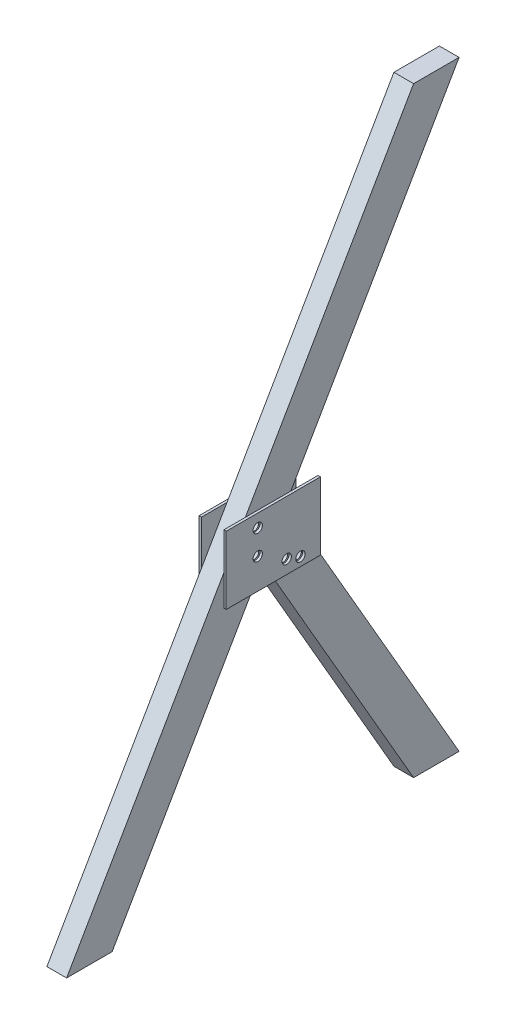
ISO-10303-21;
HEADER;
FILE_DESCRIPTION(('STEP AP214'),'2;1');
FILE_NAME('part.step','',(''),(''),'','','');
FILE_SCHEMA(('AUTOMOTIVE_DESIGN { 1 0 10303 214 1 1 1 1 }'));
ENDSEC;
DATA;
#1=APPLICATION_CONTEXT('core data for automotive mechanical design processes');
#2=APPLICATION_PROTOCOL_DEFINITION('international standard','automotive_design',2000,#1);
#3=PRODUCT_CONTEXT('',#1,'mechanical');
#4=PRODUCT('Part','Part','',(#3));
#5=PRODUCT_RELATED_PRODUCT_CATEGORY('part','',(#4));
#6=PRODUCT_DEFINITION_FORMATION('','',#4);
#7=PRODUCT_DEFINITION_CONTEXT('part definition',#1,'design');
#8=PRODUCT_DEFINITION('design','',#6,#7);
#9=PRODUCT_DEFINITION_SHAPE('','',#8);
#10=(LENGTH_UNIT() NAMED_UNIT(*) SI_UNIT(.MILLI.,.METRE.));
#11=(NAMED_UNIT(*) PLANE_ANGLE_UNIT() SI_UNIT($,.RADIAN.));
#12=(NAMED_UNIT(*) SI_UNIT($,.STERADIAN.) SOLID_ANGLE_UNIT());
#13=UNCERTAINTY_MEASURE_WITH_UNIT(LENGTH_MEASURE(1.E-05),#10,'distance_accuracy_value','');
#14=(GEOMETRIC_REPRESENTATION_CONTEXT(3) GLOBAL_UNCERTAINTY_ASSIGNED_CONTEXT((#13)) GLOBAL_UNIT_ASSIGNED_CONTEXT((#10,
#11,#12)) REPRESENTATION_CONTEXT('',''));
#15=CARTESIAN_POINT('',(0.,0.,0.));
#16=DIRECTION('',(0.,0.,1.));
#17=DIRECTION('',(1.,0.,0.));
#18=AXIS2_PLACEMENT_3D('',#15,#16,#17);
#19=CARTESIAN_POINT('',(-138.643481439755,307.813251285645,858.345365101981));
#20=DIRECTION('',(0.,1.,0.));
#21=DIRECTION('',(-1.,0.,0.));
#22=AXIS2_PLACEMENT_3D('',#19,#20,#21);
#23=PLANE('',#22);
#24=DIRECTION('',(0.,0.,-1.));
#25=VECTOR('',#24,1.);
#26=CARTESIAN_POINT('',(-138.643481439755,307.813251285645,858.345365101981));
#27=LINE('',#26,#25);
#28=CARTESIAN_POINT('',(-138.643481439755,307.813251285645,878.345365101981));
#29=VERTEX_POINT('',#28);
#30=CARTESIAN_POINT('',(-138.643481439755,307.813251285645,756.865365101981));
#31=VERTEX_POINT('',#30);
#32=EDGE_CURVE('E53',#29,#31,#27,.T.);
#33=ORIENTED_EDGE('',*,*,#32,.T.);
#34=DIRECTION('',(1.,0.,0.));
#35=VECTOR('',#34,1.);
#36=CARTESIAN_POINT('',(-138.643481439755,307.813251285645,756.865365101981));
#37=LINE('',#36,#35);
#38=CARTESIAN_POINT('',(-135.483481439755,307.813251285645,756.865365101981));
#39=VERTEX_POINT('',#38);
#40=EDGE_CURVE('E91',#31,#39,#37,.T.);
#41=ORIENTED_EDGE('',*,*,#40,.T.);
#42=DIRECTION('',(0.,0.,-1.));
#43=VECTOR('',#42,1.);
#44=CARTESIAN_POINT('',(-135.483481439755,307.813251285645,858.345365101981));
#45=LINE('',#44,#43);
#46=CARTESIAN_POINT('',(-135.483481439755,307.813251285645,878.345365101981));
#47=VERTEX_POINT('',#46);
#48=EDGE_CURVE('E105',#47,#39,#45,.T.);
#49=ORIENTED_EDGE('',*,*,#48,.F.);
#50=DIRECTION('',(1.,0.,0.));
#51=VECTOR('',#50,1.);
#52=CARTESIAN_POINT('',(-138.643481439755,307.813251285645,878.345365101981));
#53=LINE('',#52,#51);
#54=EDGE_CURVE('E101',#29,#47,#53,.T.);
#55=ORIENTED_EDGE('',*,*,#54,.F.);
#56=EDGE_LOOP('',(#33,#41,#49,#55));
#57=FACE_BOUND('',#56,.T.);
#58=ADVANCED_FACE('F45',(#57),#23,.F.);
#59=CARTESIAN_POINT('',(-138.643481439755,395.183251285645,858.345365101981));
#60=DIRECTION('',(0.,-1.,0.));
#61=DIRECTION('',(1.,0.,0.));
#62=AXIS2_PLACEMENT_3D('',#59,#60,#61);
#63=PLANE('',#62);
#64=DIRECTION('',(0.,0.,1.));
#65=VECTOR('',#64,1.);
#66=CARTESIAN_POINT('',(-135.483481439755,395.183251285645,858.345365101981));
#67=LINE('',#66,#65);
#68=CARTESIAN_POINT('',(-135.483481439755,395.183251285645,756.865365101981));
#69=VERTEX_POINT('',#68);
#70=CARTESIAN_POINT('',(-135.483481439755,395.183251285645,878.345365101981));
#71=VERTEX_POINT('',#70);
#72=EDGE_CURVE('E102',#69,#71,#67,.T.);
#73=ORIENTED_EDGE('',*,*,#72,.F.);
#74=DIRECTION('',(-1.,0.,0.));
#75=VECTOR('',#74,1.);
#76=CARTESIAN_POINT('',(-138.643481439755,395.183251285645,756.865365101981));
#77=LINE('',#76,#75);
#78=CARTESIAN_POINT('',(-138.643481439755,395.183251285645,756.865365101981));
#79=VERTEX_POINT('',#78);
#80=EDGE_CURVE('E136',#69,#79,#77,.T.);
#81=ORIENTED_EDGE('',*,*,#80,.T.);
#82=DIRECTION('',(0.,0.,1.));
#83=VECTOR('',#82,1.);
#84=CARTESIAN_POINT('',(-138.643481439755,395.183251285645,858.345365101981));
#85=LINE('',#84,#83);
#86=CARTESIAN_POINT('',(-138.643481439755,395.183251285645,878.345365101981));
#87=VERTEX_POINT('',#86);
#88=EDGE_CURVE('E12',#79,#87,#85,.T.);
#89=ORIENTED_EDGE('',*,*,#88,.T.);
#90=DIRECTION('',(1.,0.,0.));
#91=VECTOR('',#90,1.);
#92=CARTESIAN_POINT('',(-138.643481439755,395.183251285645,878.345365101981));
#93=LINE('',#92,#91);
#94=EDGE_CURVE('E138',#87,#71,#93,.T.);
#95=ORIENTED_EDGE('',*,*,#94,.T.);
#96=EDGE_LOOP('',(#73,#81,#89,#95));
#97=FACE_BOUND('',#96,.T.);
#98=ADVANCED_FACE('F147',(#97),#63,.F.);
#99=CARTESIAN_POINT('',(-138.643481439755,323.791497900955,805.380436506788));
#100=DIRECTION('',(-1.,0.,0.));
#101=DIRECTION('',(0.,0.,-1.));
#102=AXIS2_PLACEMENT_3D('',#99,#100,#101);
#103=PLANE('',#102);
#104=CARTESIAN_POINT('',(-138.643481439755,325.185058975066,800.388882117615));
#105=DIRECTION('',(1.,0.,0.));
#106=DIRECTION('',(0.,0.,-1.));
#107=AXIS2_PLACEMENT_3D('',#104,#105,#106);
#108=CIRCLE('',#107,5.99999999999999);
#109=CARTESIAN_POINT('',(-138.643481439755,325.185058975066,794.388882117615));
#110=VERTEX_POINT('',#109);
#111=EDGE_CURVE('E118',#110,#110,#108,.T.);
#112=ORIENTED_EDGE('',*,*,#111,.T.);
#113=EDGE_LOOP('',(#112));
#114=FACE_BOUND('',#113,.T.);
#115=CARTESIAN_POINT('',(-138.643481439755,319.185058975066,782.744513254983));
#116=DIRECTION('',(1.,0.,0.));
#117=DIRECTION('',(0.,0.,-1.));
#118=AXIS2_PLACEMENT_3D('',#115,#116,#117);
#119=CIRCLE('',#118,5.99999999999999);
#120=CARTESIAN_POINT('',(-138.643481439755,319.185058975066,776.744513254983));
#121=VERTEX_POINT('',#120);
#122=EDGE_CURVE('E124',#121,#121,#119,.T.);
#123=ORIENTED_EDGE('',*,*,#122,.T.);
#124=EDGE_LOOP('',(#123));
#125=FACE_BOUND('',#124,.T.);
#126=CARTESIAN_POINT('',(-138.643481439755,378.608471800518,837.704022146046));
#127=DIRECTION('',(1.,0.,0.));
#128=DIRECTION('',(0.,0.,-1.));
#129=AXIS2_PLACEMENT_3D('',#126,#127,#128);
#130=CIRCLE('',#129,5.99999999999999);
#131=CARTESIAN_POINT('',(-138.643481439755,378.608471800518,831.704022146046));
#132=VERTEX_POINT('',#131);
#133=EDGE_CURVE('E114',#132,#132,#130,.T.);
#134=ORIENTED_EDGE('',*,*,#133,.T.);
#135=EDGE_LOOP('',(#134));
#136=FACE_BOUND('',#135,.T.);
#137=CARTESIAN_POINT('',(-138.643481439755,346.939392625076,837.704022146046));
#138=DIRECTION('',(1.,0.,0.));
#139=DIRECTION('',(0.,0.,-1.));
#140=AXIS2_PLACEMENT_3D('',#137,#138,#139);
#141=CIRCLE('',#140,5.99999999999999);
#142=CARTESIAN_POINT('',(-138.643481439755,346.939392625076,831.704022146046));
#143=VERTEX_POINT('',#142);
#144=EDGE_CURVE('E122',#143,#143,#141,.T.);
#145=ORIENTED_EDGE('',*,*,#144,.T.);
#146=EDGE_LOOP('',(#145));
#147=FACE_BOUND('',#146,.T.);
#148=ORIENTED_EDGE('',*,*,#88,.F.);
#149=DIRECTION('',(0.,-1.,0.));
#150=VECTOR('',#149,1.);
#151=CARTESIAN_POINT('',(-138.643481439755,395.183251285645,756.865365101981));
#152=LINE('',#151,#150);
#153=EDGE_CURVE('E84',#79,#31,#152,.T.);
#154=ORIENTED_EDGE('',*,*,#153,.T.);
#155=ORIENTED_EDGE('',*,*,#32,.F.);
#156=DIRECTION('',(0.,-1.,0.));
#157=VECTOR('',#156,1.);
#158=CARTESIAN_POINT('',(-138.643481439755,395.183251285645,878.345365101981));
#159=LINE('',#158,#157);
#160=EDGE_CURVE('E61',#87,#29,#159,.T.);
#161=ORIENTED_EDGE('',*,*,#160,.F.);
#162=EDGE_LOOP('',(#148,#154,#155,#161));
#163=FACE_BOUND('',#162,.T.);
#164=ADVANCED_FACE('F86',(#114,#125,#136,#147,#163),#103,.T.);
#165=CARTESIAN_POINT('',(-135.483481439755,323.791497900955,805.380436506788));
#166=DIRECTION('',(-1.,0.,0.));
#167=DIRECTION('',(0.,0.,-1.));
#168=AXIS2_PLACEMENT_3D('',#165,#166,#167);
#169=PLANE('',#168);
#170=CARTESIAN_POINT('',(-135.483481439755,325.185058975066,800.388882117615));
#171=DIRECTION('',(1.,0.,0.));
#172=DIRECTION('',(0.,0.,-1.));
#173=AXIS2_PLACEMENT_3D('',#170,#171,#172);
#174=CIRCLE('',#173,5.99999999999999);
#175=CARTESIAN_POINT('',(-135.483481439755,325.185058975066,794.388882117615));
#176=VERTEX_POINT('',#175);
#177=EDGE_CURVE('E48',#176,#176,#174,.T.);
#178=ORIENTED_EDGE('',*,*,#177,.F.);
#179=EDGE_LOOP('',(#178));
#180=FACE_BOUND('',#179,.T.);
#181=CARTESIAN_POINT('',(-135.483481439755,319.185058975066,782.744513254983));
#182=DIRECTION('',(1.,0.,0.));
#183=DIRECTION('',(0.,0.,-1.));
#184=AXIS2_PLACEMENT_3D('',#181,#182,#183);
#185=CIRCLE('',#184,5.99999999999999);
#186=CARTESIAN_POINT('',(-135.483481439755,319.185058975066,776.744513254983));
#187=VERTEX_POINT('',#186);
#188=EDGE_CURVE('E116',#187,#187,#185,.T.);
#189=ORIENTED_EDGE('',*,*,#188,.F.);
#190=EDGE_LOOP('',(#189));
#191=FACE_BOUND('',#190,.T.);
#192=CARTESIAN_POINT('',(-135.483481439755,378.608471800518,837.704022146046));
#193=DIRECTION('',(1.,0.,0.));
#194=DIRECTION('',(0.,0.,-1.));
#195=AXIS2_PLACEMENT_3D('',#192,#193,#194);
#196=CIRCLE('',#195,5.99999999999999);
#197=CARTESIAN_POINT('',(-135.483481439755,378.608471800518,831.704022146046));
#198=VERTEX_POINT('',#197);
#199=EDGE_CURVE('E92',#198,#198,#196,.T.);
#200=ORIENTED_EDGE('',*,*,#199,.F.);
#201=EDGE_LOOP('',(#200));
#202=FACE_BOUND('',#201,.T.);
#203=CARTESIAN_POINT('',(-135.483481439755,346.939392625076,837.704022146046));
#204=DIRECTION('',(1.,0.,0.));
#205=DIRECTION('',(0.,0.,-1.));
#206=AXIS2_PLACEMENT_3D('',#203,#204,#205);
#207=CIRCLE('',#206,5.99999999999999);
#208=CARTESIAN_POINT('',(-135.483481439755,346.939392625076,831.704022146046));
#209=VERTEX_POINT('',#208);
#210=EDGE_CURVE('E111',#209,#209,#207,.T.);
#211=ORIENTED_EDGE('',*,*,#210,.F.);
#212=EDGE_LOOP('',(#211));
#213=FACE_BOUND('',#212,.T.);
#214=ORIENTED_EDGE('',*,*,#48,.T.);
#215=DIRECTION('',(0.,1.,0.));
#216=VECTOR('',#215,1.);
#217=CARTESIAN_POINT('',(-135.483481439755,395.183251285645,756.865365101981));
#218=LINE('',#217,#216);
#219=EDGE_CURVE('E96',#39,#69,#218,.T.);
#220=ORIENTED_EDGE('',*,*,#219,.T.);
#221=ORIENTED_EDGE('',*,*,#72,.T.);
#222=DIRECTION('',(0.,-1.,0.));
#223=VECTOR('',#222,1.);
#224=CARTESIAN_POINT('',(-135.483481439755,395.183251285645,878.345365101981));
#225=LINE('',#224,#223);
#226=EDGE_CURVE('E141',#71,#47,#225,.T.);
#227=ORIENTED_EDGE('',*,*,#226,.T.);
#228=EDGE_LOOP('',(#214,#220,#221,#227));
#229=FACE_BOUND('',#228,.T.);
#230=ADVANCED_FACE('F144',(#180,#191,#202,#213,#229),#169,.F.);
#231=CARTESIAN_POINT('',(-135.483481439755,323.791497900955,878.345365101981));
#232=DIRECTION('',(0.,0.,1.));
#233=DIRECTION('',(0.,-1.,0.));
#234=AXIS2_PLACEMENT_3D('',#231,#232,#233);
#235=PLANE('',#234);
#236=ORIENTED_EDGE('',*,*,#94,.F.);
#237=ORIENTED_EDGE('',*,*,#160,.T.);
#238=ORIENTED_EDGE('',*,*,#54,.T.);
#239=ORIENTED_EDGE('',*,*,#226,.F.);
#240=EDGE_LOOP('',(#236,#237,#238,#239));
#241=FACE_BOUND('',#240,.T.);
#242=ADVANCED_FACE('F142',(#241),#235,.T.);
#243=CARTESIAN_POINT('',(-135.483481439755,323.791497900955,756.865365101981));
#244=DIRECTION('',(0.,0.,-1.));
#245=DIRECTION('',(1.,0.,0.));
#246=AXIS2_PLACEMENT_3D('',#243,#244,#245);
#247=PLANE('',#246);
#248=ORIENTED_EDGE('',*,*,#153,.F.);
#249=ORIENTED_EDGE('',*,*,#80,.F.);
#250=ORIENTED_EDGE('',*,*,#219,.F.);
#251=ORIENTED_EDGE('',*,*,#40,.F.);
#252=EDGE_LOOP('',(#248,#249,#250,#251));
#253=FACE_BOUND('',#252,.T.);
#254=ADVANCED_FACE('F95',(#253),#247,.T.);
#255=CARTESIAN_POINT('',(-71.6434814397549,346.939392625076,837.704022146046));
#256=DIRECTION('',(-1.,0.,0.));
#257=DIRECTION('',(0.,0.,-1.));
#258=AXIS2_PLACEMENT_3D('',#255,#256,#257);
#259=CYLINDRICAL_SURFACE('',#258,5.99999999999999);
#260=ORIENTED_EDGE('',*,*,#144,.F.);
#261=EDGE_LOOP('',(#260));
#262=FACE_BOUND('',#261,.T.);
#263=ORIENTED_EDGE('',*,*,#210,.T.);
#264=EDGE_LOOP('',(#263));
#265=FACE_BOUND('',#264,.T.);
#266=ADVANCED_FACE('F162',(#262,#265),#259,.F.);
#267=CARTESIAN_POINT('',(-71.6434814397549,378.608471800518,837.704022146046));
#268=DIRECTION('',(-1.,0.,0.));
#269=DIRECTION('',(0.,0.,-1.));
#270=AXIS2_PLACEMENT_3D('',#267,#268,#269);
#271=CYLINDRICAL_SURFACE('',#270,5.99999999999999);
#272=ORIENTED_EDGE('',*,*,#133,.F.);
#273=EDGE_LOOP('',(#272));
#274=FACE_BOUND('',#273,.T.);
#275=ORIENTED_EDGE('',*,*,#199,.T.);
#276=EDGE_LOOP('',(#275));
#277=FACE_BOUND('',#276,.T.);
#278=ADVANCED_FACE('F165',(#274,#277),#271,.F.);
#279=CARTESIAN_POINT('',(-71.6434814397547,319.185058975066,782.744513254983));
#280=DIRECTION('',(-1.,0.,0.));
#281=DIRECTION('',(0.,0.,-1.));
#282=AXIS2_PLACEMENT_3D('',#279,#280,#281);
#283=CYLINDRICAL_SURFACE('',#282,5.99999999999999);
#284=ORIENTED_EDGE('',*,*,#122,.F.);
#285=EDGE_LOOP('',(#284));
#286=FACE_BOUND('',#285,.T.);
#287=ORIENTED_EDGE('',*,*,#188,.T.);
#288=EDGE_LOOP('',(#287));
#289=FACE_BOUND('',#288,.T.);
#290=ADVANCED_FACE('F169',(#286,#289),#283,.F.);
#291=CARTESIAN_POINT('',(-71.6434814397548,325.185058975066,800.388882117615));
#292=DIRECTION('',(-1.,0.,0.));
#293=DIRECTION('',(0.,0.,-1.));
#294=AXIS2_PLACEMENT_3D('',#291,#292,#293);
#295=CYLINDRICAL_SURFACE('',#294,5.99999999999999);
#296=ORIENTED_EDGE('',*,*,#111,.F.);
#297=EDGE_LOOP('',(#296));
#298=FACE_BOUND('',#297,.T.);
#299=ORIENTED_EDGE('',*,*,#177,.T.);
#300=EDGE_LOOP('',(#299));
#301=FACE_BOUND('',#300,.T.);
#302=ADVANCED_FACE('F173',(#298,#301),#295,.F.);
#303=CLOSED_SHELL('',(#58,#98,#164,#230,#242,#254,#266,#278,#290,#302));
#304=MANIFOLD_SOLID_BREP('B2',#303);
#305=CARTESIAN_POINT('',(-108.503481439755,-5.40779182492037,573.434865042183));
#306=DIRECTION('',(0.,1.,0.));
#307=DIRECTION('',(0.,0.,1.));
#308=AXIS2_PLACEMENT_3D('',#305,#306,#307);
#309=PLANE('',#308);
#310=DIRECTION('',(0.,0.,-1.));
#311=VECTOR('',#310,1.);
#312=CARTESIAN_POINT('',(-133.903481439755,-5.40779182492037,573.434865042183));
#313=LINE('',#312,#311);
#314=CARTESIAN_POINT('',(-133.903481439755,-5.40779182492035,632.093652391849));
#315=VERTEX_POINT('',#314);
#316=CARTESIAN_POINT('',(-133.903481439755,-5.40779182492037,573.434865042183));
#317=VERTEX_POINT('',#316);
#318=EDGE_CURVE('E340',#315,#317,#313,.T.);
#319=ORIENTED_EDGE('',*,*,#318,.T.);
#320=DIRECTION('',(-1.,0.,0.));
#321=VECTOR('',#320,1.);
#322=CARTESIAN_POINT('',(-108.503481439755,-5.40779182492037,573.434865042183));
#323=LINE('',#322,#321);
#324=CARTESIAN_POINT('',(-108.503481439755,-5.40779182492037,573.434865042183));
#325=VERTEX_POINT('',#324);
#326=EDGE_CURVE('E43',#325,#317,#323,.T.);
#327=ORIENTED_EDGE('',*,*,#326,.F.);
#328=DIRECTION('',(0.,0.,-1.));
#329=VECTOR('',#328,1.);
#330=CARTESIAN_POINT('',(-108.503481439755,-5.40779182492037,573.434865042183));
#331=LINE('',#330,#329);
#332=CARTESIAN_POINT('',(-108.503481439755,-5.40779182492035,632.093652391849));
#333=VERTEX_POINT('',#332);
#334=EDGE_CURVE('E327',#333,#325,#331,.T.);
#335=ORIENTED_EDGE('',*,*,#334,.F.);
#336=DIRECTION('',(-1.,0.,0.));
#337=VECTOR('',#336,1.);
#338=CARTESIAN_POINT('',(-108.503481439755,-5.40779182492035,632.093652391849));
#339=LINE('',#338,#337);
#340=EDGE_CURVE('E336',#333,#315,#339,.T.);
#341=ORIENTED_EDGE('',*,*,#340,.T.);
#342=EDGE_LOOP('',(#319,#327,#335,#341));
#343=FACE_BOUND('',#342,.T.);
#344=ADVANCED_FACE('F274',(#343),#309,.F.);
#345=CARTESIAN_POINT('',(-108.503481439755,354.251999806627,781.084542557341));
#346=DIRECTION('',(0.,-0.499999999999998,0.86602540378444));
#347=DIRECTION('',(0.,-0.86602540378444,-0.499999999999998));
#348=AXIS2_PLACEMENT_3D('',#345,#346,#347);
#349=PLANE('',#348);
#350=DIRECTION('',(0.,0.86602540378444,0.499999999999998));
#351=VECTOR('',#350,1.);
#352=CARTESIAN_POINT('',(-133.903481439755,354.251999806627,781.084542557341));
#353=LINE('',#352,#351);
#354=CARTESIAN_POINT('',(-133.903481439755,354.251999806627,781.084542557341));
#355=VERTEX_POINT('',#354);
#356=EDGE_CURVE('E331',#317,#355,#353,.T.);
#357=ORIENTED_EDGE('',*,*,#356,.T.);
#358=DIRECTION('',(-1.,0.,0.));
#359=VECTOR('',#358,1.);
#360=CARTESIAN_POINT('',(-108.503481439755,354.251999806627,781.084542557341));
#361=LINE('',#360,#359);
#362=CARTESIAN_POINT('',(-108.503481439755,354.251999806627,781.084542557341));
#363=VERTEX_POINT('',#362);
#364=EDGE_CURVE('E283',#363,#355,#361,.T.);
#365=ORIENTED_EDGE('',*,*,#364,.F.);
#366=DIRECTION('',(0.,0.86602540378444,0.499999999999998));
#367=VECTOR('',#366,1.);
#368=CARTESIAN_POINT('',(-108.503481439755,354.251999806627,781.084542557341));
#369=LINE('',#368,#367);
#370=EDGE_CURVE('E322',#325,#363,#369,.T.);
#371=ORIENTED_EDGE('',*,*,#370,.F.);
#372=ORIENTED_EDGE('',*,*,#326,.T.);
#373=EDGE_LOOP('',(#357,#365,#371,#372));
#374=FACE_BOUND('',#373,.T.);
#375=ADVANCED_FACE('F330',(#374),#349,.F.);
#376=CARTESIAN_POINT('',(-108.503481439755,328.851999806627,825.07863306959));
#377=DIRECTION('',(0.,-0.866025403784439,-0.499999999999998));
#378=DIRECTION('',(0.,0.499999999999998,-0.86602540378444));
#379=AXIS2_PLACEMENT_3D('',#376,#377,#378);
#380=PLANE('',#379);
#381=DIRECTION('',(0.,-0.499999999999998,0.86602540378444));
#382=VECTOR('',#381,1.);
#383=CARTESIAN_POINT('',(-133.903481439755,328.851999806627,825.07863306959));
#384=LINE('',#383,#382);
#385=CARTESIAN_POINT('',(-133.903481439755,328.851999806627,825.07863306959));
#386=VERTEX_POINT('',#385);
#387=EDGE_CURVE('E309',#355,#386,#384,.T.);
#388=ORIENTED_EDGE('',*,*,#387,.T.);
#389=DIRECTION('',(-1.,0.,0.));
#390=VECTOR('',#389,1.);
#391=CARTESIAN_POINT('',(-108.503481439755,328.851999806627,825.07863306959));
#392=LINE('',#391,#390);
#393=CARTESIAN_POINT('',(-108.503481439755,328.851999806627,825.07863306959));
#394=VERTEX_POINT('',#393);
#395=EDGE_CURVE('E332',#394,#386,#392,.T.);
#396=ORIENTED_EDGE('',*,*,#395,.F.);
#397=DIRECTION('',(0.,-0.499999999999998,0.86602540378444));
#398=VECTOR('',#397,1.);
#399=CARTESIAN_POINT('',(-108.503481439755,328.851999806627,825.07863306959));
#400=LINE('',#399,#398);
#401=EDGE_CURVE('E325',#363,#394,#400,.T.);
#402=ORIENTED_EDGE('',*,*,#401,.F.);
#403=ORIENTED_EDGE('',*,*,#364,.T.);
#404=EDGE_LOOP('',(#388,#396,#402,#403));
#405=FACE_BOUND('',#404,.T.);
#406=ADVANCED_FACE('F334',(#405),#380,.F.);
#407=CARTESIAN_POINT('',(-108.503481439755,-5.40779182492035,632.093652391849));
#408=DIRECTION('',(0.,0.499999999999998,-0.86602540378444));
#409=DIRECTION('',(0.,0.86602540378444,0.499999999999998));
#410=AXIS2_PLACEMENT_3D('',#407,#408,#409);
#411=PLANE('',#410);
#412=DIRECTION('',(0.,-0.86602540378444,-0.499999999999998));
#413=VECTOR('',#412,1.);
#414=CARTESIAN_POINT('',(-133.903481439755,-5.40779182492035,632.093652391849));
#415=LINE('',#414,#413);
#416=EDGE_CURVE('E315',#386,#315,#415,.T.);
#417=ORIENTED_EDGE('',*,*,#416,.T.);
#418=ORIENTED_EDGE('',*,*,#340,.F.);
#419=DIRECTION('',(0.,-0.86602540378444,-0.499999999999998));
#420=VECTOR('',#419,1.);
#421=CARTESIAN_POINT('',(-108.503481439755,-5.40779182492035,632.093652391849));
#422=LINE('',#421,#420);
#423=EDGE_CURVE('E292',#394,#333,#422,.T.);
#424=ORIENTED_EDGE('',*,*,#423,.F.);
#425=ORIENTED_EDGE('',*,*,#395,.T.);
#426=EDGE_LOOP('',(#417,#418,#424,#425));
#427=FACE_BOUND('',#426,.T.);
#428=ADVANCED_FACE('F386',(#427),#411,.F.);
#429=CARTESIAN_POINT('',(-108.503481439755,-5.40779182492035,632.093652391849));
#430=DIRECTION('',(-1.,0.,0.));
#431=DIRECTION('',(0.,0.,1.));
#432=AXIS2_PLACEMENT_3D('',#429,#430,#431);
#433=PLANE('',#432);
#434=CARTESIAN_POINT('',(-108.503481439755,325.185058975066,800.388882117615));
#435=DIRECTION('',(-1.,0.,0.));
#436=DIRECTION('',(0.,0.,1.));
#437=AXIS2_PLACEMENT_3D('',#434,#435,#436);
#438=CIRCLE('',#437,5.99999999999999);
#439=CARTESIAN_POINT('',(-108.503481439755,325.185058975066,806.388882117615));
#440=VERTEX_POINT('',#439);
#441=EDGE_CURVE('E343',#440,#440,#438,.T.);
#442=ORIENTED_EDGE('',*,*,#441,.T.);
#443=EDGE_LOOP('',(#442));
#444=FACE_BOUND('',#443,.T.);
#445=CARTESIAN_POINT('',(-108.503481439755,319.185058975066,782.744513254983));
#446=DIRECTION('',(-1.,0.,0.));
#447=DIRECTION('',(0.,0.,1.));
#448=AXIS2_PLACEMENT_3D('',#445,#446,#447);
#449=CIRCLE('',#448,5.99999999999999);
#450=CARTESIAN_POINT('',(-108.503481439755,319.185058975066,788.744513254983));
#451=VERTEX_POINT('',#450);
#452=EDGE_CURVE('E350',#451,#451,#449,.T.);
#453=ORIENTED_EDGE('',*,*,#452,.T.);
#454=EDGE_LOOP('',(#453));
#455=FACE_BOUND('',#454,.T.);
#456=ORIENTED_EDGE('',*,*,#334,.T.);
#457=ORIENTED_EDGE('',*,*,#370,.T.);
#458=ORIENTED_EDGE('',*,*,#401,.T.);
#459=ORIENTED_EDGE('',*,*,#423,.T.);
#460=EDGE_LOOP('',(#456,#457,#458,#459));
#461=FACE_BOUND('',#460,.T.);
#462=ADVANCED_FACE('F323',(#444,#455,#461),#433,.F.);
#463=CARTESIAN_POINT('',(-133.903481439755,-5.40779182492035,632.093652391849));
#464=DIRECTION('',(-1.,0.,0.));
#465=DIRECTION('',(0.,0.,1.));
#466=AXIS2_PLACEMENT_3D('',#463,#464,#465);
#467=PLANE('',#466);
#468=CARTESIAN_POINT('',(-133.903481439755,325.185058975066,800.388882117615));
#469=DIRECTION('',(-1.,0.,0.));
#470=DIRECTION('',(0.,0.,1.));
#471=AXIS2_PLACEMENT_3D('',#468,#469,#470);
#472=CIRCLE('',#471,5.99999999999999);
#473=CARTESIAN_POINT('',(-133.903481439755,325.185058975066,806.388882117615));
#474=VERTEX_POINT('',#473);
#475=EDGE_CURVE('E277',#474,#474,#472,.T.);
#476=ORIENTED_EDGE('',*,*,#475,.F.);
#477=EDGE_LOOP('',(#476));
#478=FACE_BOUND('',#477,.T.);
#479=CARTESIAN_POINT('',(-133.903481439755,319.185058975066,782.744513254983));
#480=DIRECTION('',(-1.,0.,0.));
#481=DIRECTION('',(0.,0.,1.));
#482=AXIS2_PLACEMENT_3D('',#479,#480,#481);
#483=CIRCLE('',#482,5.99999999999999);
#484=CARTESIAN_POINT('',(-133.903481439755,319.185058975066,788.744513254983));
#485=VERTEX_POINT('',#484);
#486=EDGE_CURVE('E348',#485,#485,#483,.T.);
#487=ORIENTED_EDGE('',*,*,#486,.F.);
#488=EDGE_LOOP('',(#487));
#489=FACE_BOUND('',#488,.T.);
#490=ORIENTED_EDGE('',*,*,#318,.F.);
#491=ORIENTED_EDGE('',*,*,#416,.F.);
#492=ORIENTED_EDGE('',*,*,#387,.F.);
#493=ORIENTED_EDGE('',*,*,#356,.F.);
#494=EDGE_LOOP('',(#490,#491,#492,#493));
#495=FACE_BOUND('',#494,.T.);
#496=ADVANCED_FACE('F371',(#478,#489,#495),#467,.T.);
#497=CARTESIAN_POINT('',(-170.763481439754,319.185058975066,782.744513254983));
#498=DIRECTION('',(1.,0.,0.));
#499=DIRECTION('',(0.,0.,-1.));
#500=AXIS2_PLACEMENT_3D('',#497,#498,#499);
#501=CYLINDRICAL_SURFACE('',#500,5.99999999999999);
#502=ORIENTED_EDGE('',*,*,#486,.T.);
#503=EDGE_LOOP('',(#502));
#504=FACE_BOUND('',#503,.T.);
#505=ORIENTED_EDGE('',*,*,#452,.F.);
#506=EDGE_LOOP('',(#505));
#507=FACE_BOUND('',#506,.T.);
#508=ADVANCED_FACE('F365',(#504,#507),#501,.F.);
#509=CARTESIAN_POINT('',(-170.763481439754,325.185058975066,800.388882117615));
#510=DIRECTION('',(1.,0.,0.));
#511=DIRECTION('',(0.,0.,-1.));
#512=AXIS2_PLACEMENT_3D('',#509,#510,#511);
#513=CYLINDRICAL_SURFACE('',#512,5.99999999999999);
#514=ORIENTED_EDGE('',*,*,#475,.T.);
#515=EDGE_LOOP('',(#514));
#516=FACE_BOUND('',#515,.T.);
#517=ORIENTED_EDGE('',*,*,#441,.F.);
#518=EDGE_LOOP('',(#517));
#519=FACE_BOUND('',#518,.T.);
#520=ADVANCED_FACE('F363',(#516,#519),#513,.F.);
#521=CLOSED_SHELL('',(#344,#375,#406,#428,#462,#496,#508,#520));
#522=MANIFOLD_SOLID_BREP('B6',#521);
#523=CARTESIAN_POINT('',(-108.503481439755,769.328142095791,573.434865042183));
#524=DIRECTION('',(0.,0.500000000000004,0.866025403784436));
#525=DIRECTION('',(0.,-0.866025403784436,0.500000000000004));
#526=AXIS2_PLACEMENT_3D('',#523,#524,#525);
#527=PLANE('',#526);
#528=DIRECTION('',(0.,0.866025403784436,-0.500000000000004));
#529=VECTOR('',#528,1.);
#530=CARTESIAN_POINT('',(-133.903481439755,769.328142095791,573.434865042183));
#531=LINE('',#530,#529);
#532=CARTESIAN_POINT('',(-133.903481439755,-5.40779182492035,1020.72886504219));
#533=VERTEX_POINT('',#532);
#534=CARTESIAN_POINT('',(-133.903481439755,769.328142095791,573.434865042183));
#535=VERTEX_POINT('',#534);
#536=EDGE_CURVE('E514',#533,#535,#531,.T.);
#537=ORIENTED_EDGE('',*,*,#536,.T.);
#538=DIRECTION('',(-1.,0.,0.));
#539=VECTOR('',#538,1.);
#540=CARTESIAN_POINT('',(-108.503481439755,769.328142095791,573.434865042183));
#541=LINE('',#540,#539);
#542=CARTESIAN_POINT('',(-108.503481439755,769.328142095791,573.434865042183));
#543=VERTEX_POINT('',#542);
#544=EDGE_CURVE('E272',#543,#535,#541,.T.);
#545=ORIENTED_EDGE('',*,*,#544,.F.);
#546=DIRECTION('',(0.,0.866025403784436,-0.500000000000004));
#547=VECTOR('',#546,1.);
#548=CARTESIAN_POINT('',(-108.503481439755,769.328142095791,573.434865042183));
#549=LINE('',#548,#547);
#550=CARTESIAN_POINT('',(-108.503481439755,-5.40779182492035,1020.72886504219));
#551=VERTEX_POINT('',#550);
#552=EDGE_CURVE('E501',#551,#543,#549,.T.);
#553=ORIENTED_EDGE('',*,*,#552,.F.);
#554=DIRECTION('',(-1.,0.,0.));
#555=VECTOR('',#554,1.);
#556=CARTESIAN_POINT('',(-108.503481439755,-5.40779182492035,1020.72886504219));
#557=LINE('',#556,#555);
#558=EDGE_CURVE('E510',#551,#533,#557,.T.);
#559=ORIENTED_EDGE('',*,*,#558,.T.);
#560=EDGE_LOOP('',(#537,#545,#553,#559));
#561=FACE_BOUND('',#560,.T.);
#562=ADVANCED_FACE('F448',(#561),#527,.F.);
#563=CARTESIAN_POINT('',(-108.503481439755,769.328142095791,632.09365239185));
#564=DIRECTION('',(0.,-1.,0.));
#565=DIRECTION('',(0.,0.,-1.));
#566=AXIS2_PLACEMENT_3D('',#563,#564,#565);
#567=PLANE('',#566);
#568=DIRECTION('',(0.,0.,1.));
#569=VECTOR('',#568,1.);
#570=CARTESIAN_POINT('',(-133.903481439755,769.328142095791,632.09365239185));
#571=LINE('',#570,#569);
#572=CARTESIAN_POINT('',(-133.903481439755,769.328142095791,632.09365239185));
#573=VERTEX_POINT('',#572);
#574=EDGE_CURVE('E505',#535,#573,#571,.T.);
#575=ORIENTED_EDGE('',*,*,#574,.T.);
#576=DIRECTION('',(-1.,0.,0.));
#577=VECTOR('',#576,1.);
#578=CARTESIAN_POINT('',(-108.503481439755,769.328142095791,632.09365239185));
#579=LINE('',#578,#577);
#580=CARTESIAN_POINT('',(-108.503481439755,769.328142095791,632.09365239185));
#581=VERTEX_POINT('',#580);
#582=EDGE_CURVE('E457',#581,#573,#579,.T.);
#583=ORIENTED_EDGE('',*,*,#582,.F.);
#584=DIRECTION('',(0.,0.,1.));
#585=VECTOR('',#584,1.);
#586=CARTESIAN_POINT('',(-108.503481439755,769.328142095791,632.09365239185));
#587=LINE('',#586,#585);
#588=EDGE_CURVE('E496',#543,#581,#587,.T.);
#589=ORIENTED_EDGE('',*,*,#588,.F.);
#590=ORIENTED_EDGE('',*,*,#544,.T.);
#591=EDGE_LOOP('',(#575,#583,#589,#590));
#592=FACE_BOUND('',#591,.T.);
#593=ADVANCED_FACE('F504',(#592),#567,.F.);
#594=CARTESIAN_POINT('',(-108.503481439755,-5.40779182492036,1079.38765239185));
#595=DIRECTION('',(0.,-0.500000000000004,-0.866025403784436));
#596=DIRECTION('',(0.,0.866025403784436,-0.500000000000004));
#597=AXIS2_PLACEMENT_3D('',#594,#595,#596);
#598=PLANE('',#597);
#599=DIRECTION('',(0.,-0.866025403784436,0.500000000000004));
#600=VECTOR('',#599,1.);
#601=CARTESIAN_POINT('',(-133.903481439755,-5.40779182492036,1079.38765239185));
#602=LINE('',#601,#600);
#603=CARTESIAN_POINT('',(-133.903481439755,-5.40779182492036,1079.38765239185));
#604=VERTEX_POINT('',#603);
#605=EDGE_CURVE('E483',#573,#604,#602,.T.);
#606=ORIENTED_EDGE('',*,*,#605,.T.);
#607=DIRECTION('',(-1.,0.,0.));
#608=VECTOR('',#607,1.);
#609=CARTESIAN_POINT('',(-108.503481439755,-5.40779182492036,1079.38765239185));
#610=LINE('',#609,#608);
#611=CARTESIAN_POINT('',(-108.503481439755,-5.40779182492036,1079.38765239185));
#612=VERTEX_POINT('',#611);
#613=EDGE_CURVE('E506',#612,#604,#610,.T.);
#614=ORIENTED_EDGE('',*,*,#613,.F.);
#615=DIRECTION('',(0.,-0.866025403784436,0.500000000000004));
#616=VECTOR('',#615,1.);
#617=CARTESIAN_POINT('',(-108.503481439755,-5.40779182492036,1079.38765239185));
#618=LINE('',#617,#616);
#619=EDGE_CURVE('E499',#581,#612,#618,.T.);
#620=ORIENTED_EDGE('',*,*,#619,.F.);
#621=ORIENTED_EDGE('',*,*,#582,.T.);
#622=EDGE_LOOP('',(#606,#614,#620,#621));
#623=FACE_BOUND('',#622,.T.);
#624=ADVANCED_FACE('F508',(#623),#598,.F.);
#625=CARTESIAN_POINT('',(-108.503481439755,-5.40779182492035,1020.72886504219));
#626=DIRECTION('',(0.,1.,0.));
#627=DIRECTION('',(0.,0.,1.));
#628=AXIS2_PLACEMENT_3D('',#625,#626,#627);
#629=PLANE('',#628);
#630=DIRECTION('',(0.,0.,-1.));
#631=VECTOR('',#630,1.);
#632=CARTESIAN_POINT('',(-133.903481439755,-5.40779182492035,1020.72886504219));
#633=LINE('',#632,#631);
#634=EDGE_CURVE('E489',#604,#533,#633,.T.);
#635=ORIENTED_EDGE('',*,*,#634,.T.);
#636=ORIENTED_EDGE('',*,*,#558,.F.);
#637=DIRECTION('',(0.,0.,-1.));
#638=VECTOR('',#637,1.);
#639=CARTESIAN_POINT('',(-108.503481439755,-5.40779182492035,1020.72886504219));
#640=LINE('',#639,#638);
#641=EDGE_CURVE('E466',#612,#551,#640,.T.);
#642=ORIENTED_EDGE('',*,*,#641,.F.);
#643=ORIENTED_EDGE('',*,*,#613,.T.);
#644=EDGE_LOOP('',(#635,#636,#642,#643));
#645=FACE_BOUND('',#644,.T.);
#646=ADVANCED_FACE('F560',(#645),#629,.F.);
#647=CARTESIAN_POINT('',(-108.503481439755,-5.40779182492035,1020.72886504219));
#648=DIRECTION('',(-1.,0.,0.));
#649=DIRECTION('',(0.,0.,1.));
#650=AXIS2_PLACEMENT_3D('',#647,#648,#649);
#651=PLANE('',#650);
#652=CARTESIAN_POINT('',(-108.503481439755,378.608471800518,837.704022146046));
#653=DIRECTION('',(-1.,0.,0.));
#654=DIRECTION('',(0.,0.,1.));
#655=AXIS2_PLACEMENT_3D('',#652,#653,#654);
#656=CIRCLE('',#655,5.99999999999999);
#657=CARTESIAN_POINT('',(-108.503481439755,378.608471800518,843.704022146046));
#658=VERTEX_POINT('',#657);
#659=EDGE_CURVE('E517',#658,#658,#656,.T.);
#660=ORIENTED_EDGE('',*,*,#659,.T.);
#661=EDGE_LOOP('',(#660));
#662=FACE_BOUND('',#661,.T.);
#663=CARTESIAN_POINT('',(-108.503481439755,346.939392625076,837.704022146046));
#664=DIRECTION('',(-1.,0.,0.));
#665=DIRECTION('',(0.,0.,1.));
#666=AXIS2_PLACEMENT_3D('',#663,#664,#665);
#667=CIRCLE('',#666,5.99999999999999);
#668=CARTESIAN_POINT('',(-108.503481439755,346.939392625076,843.704022146046));
#669=VERTEX_POINT('',#668);
#670=EDGE_CURVE('E524',#669,#669,#667,.T.);
#671=ORIENTED_EDGE('',*,*,#670,.T.);
#672=EDGE_LOOP('',(#671));
#673=FACE_BOUND('',#672,.T.);
#674=ORIENTED_EDGE('',*,*,#552,.T.);
#675=ORIENTED_EDGE('',*,*,#588,.T.);
#676=ORIENTED_EDGE('',*,*,#619,.T.);
#677=ORIENTED_EDGE('',*,*,#641,.T.);
#678=EDGE_LOOP('',(#674,#675,#676,#677));
#679=FACE_BOUND('',#678,.T.);
#680=ADVANCED_FACE('F497',(#662,#673,#679),#651,.F.);
#681=CARTESIAN_POINT('',(-133.903481439755,-5.40779182492035,1020.72886504219));
#682=DIRECTION('',(-1.,0.,0.));
#683=DIRECTION('',(0.,0.,1.));
#684=AXIS2_PLACEMENT_3D('',#681,#682,#683);
#685=PLANE('',#684);
#686=CARTESIAN_POINT('',(-133.903481439755,378.608471800518,837.704022146046));
#687=DIRECTION('',(-1.,0.,0.));
#688=DIRECTION('',(0.,0.,1.));
#689=AXIS2_PLACEMENT_3D('',#686,#687,#688);
#690=CIRCLE('',#689,5.99999999999999);
#691=CARTESIAN_POINT('',(-133.903481439755,378.608471800518,843.704022146046));
#692=VERTEX_POINT('',#691);
#693=EDGE_CURVE('E451',#692,#692,#690,.T.);
#694=ORIENTED_EDGE('',*,*,#693,.F.);
#695=EDGE_LOOP('',(#694));
#696=FACE_BOUND('',#695,.T.);
#697=CARTESIAN_POINT('',(-133.903481439755,346.939392625076,837.704022146046));
#698=DIRECTION('',(-1.,0.,0.));
#699=DIRECTION('',(0.,0.,1.));
#700=AXIS2_PLACEMENT_3D('',#697,#698,#699);
#701=CIRCLE('',#700,5.99999999999999);
#702=CARTESIAN_POINT('',(-133.903481439755,346.939392625076,843.704022146046));
#703=VERTEX_POINT('',#702);
#704=EDGE_CURVE('E522',#703,#703,#701,.T.);
#705=ORIENTED_EDGE('',*,*,#704,.F.);
#706=EDGE_LOOP('',(#705));
#707=FACE_BOUND('',#706,.T.);
#708=ORIENTED_EDGE('',*,*,#536,.F.);
#709=ORIENTED_EDGE('',*,*,#634,.F.);
#710=ORIENTED_EDGE('',*,*,#605,.F.);
#711=ORIENTED_EDGE('',*,*,#574,.F.);
#712=EDGE_LOOP('',(#708,#709,#710,#711));
#713=FACE_BOUND('',#712,.T.);
#714=ADVANCED_FACE('F545',(#696,#707,#713),#685,.T.);
#715=CARTESIAN_POINT('',(-170.763481439754,346.939392625076,837.704022146046));
#716=DIRECTION('',(1.,0.,0.));
#717=DIRECTION('',(0.,0.,-1.));
#718=AXIS2_PLACEMENT_3D('',#715,#716,#717);
#719=CYLINDRICAL_SURFACE('',#718,5.99999999999999);
#720=ORIENTED_EDGE('',*,*,#704,.T.);
#721=EDGE_LOOP('',(#720));
#722=FACE_BOUND('',#721,.T.);
#723=ORIENTED_EDGE('',*,*,#670,.F.);
#724=EDGE_LOOP('',(#723));
#725=FACE_BOUND('',#724,.T.);
#726=ADVANCED_FACE('F539',(#722,#725),#719,.F.);
#727=CARTESIAN_POINT('',(-170.763481439754,378.608471800518,837.704022146046));
#728=DIRECTION('',(1.,0.,0.));
#729=DIRECTION('',(0.,0.,-1.));
#730=AXIS2_PLACEMENT_3D('',#727,#728,#729);
#731=CYLINDRICAL_SURFACE('',#730,5.99999999999999);
#732=ORIENTED_EDGE('',*,*,#693,.T.);
#733=EDGE_LOOP('',(#732));
#734=FACE_BOUND('',#733,.T.);
#735=ORIENTED_EDGE('',*,*,#659,.F.);
#736=EDGE_LOOP('',(#735));
#737=FACE_BOUND('',#736,.T.);
#738=ADVANCED_FACE('F537',(#734,#737),#731,.F.);
#739=CLOSED_SHELL('',(#562,#593,#624,#646,#680,#714,#726,#738));
#740=MANIFOLD_SOLID_BREP('B37',#739);
#741=CARTESIAN_POINT('',(-103.763481439754,307.813251285645,858.345365101981));
#742=DIRECTION('',(0.,1.,0.));
#743=DIRECTION('',(1.,0.,0.));
#744=AXIS2_PLACEMENT_3D('',#741,#742,#743);
#745=PLANE('',#744);
#746=DIRECTION('',(0.,0.,-1.));
#747=VECTOR('',#746,1.);
#748=CARTESIAN_POINT('',(-103.763481439754,307.813251285645,858.345365101981));
#749=LINE('',#748,#747);
#750=CARTESIAN_POINT('',(-103.763481439754,307.813251285645,878.345365101981));
#751=VERTEX_POINT('',#750);
#752=CARTESIAN_POINT('',(-103.763481439754,307.813251285645,756.865365101981));
#753=VERTEX_POINT('',#752);
#754=EDGE_CURVE('E621',#751,#753,#749,.T.);
#755=ORIENTED_EDGE('',*,*,#754,.F.);
#756=DIRECTION('',(-1.,0.,0.));
#757=VECTOR('',#756,1.);
#758=CARTESIAN_POINT('',(-103.763481439754,307.813251285645,878.345365101981));
#759=LINE('',#758,#757);
#760=CARTESIAN_POINT('',(-106.923481439754,307.813251285645,878.345365101981));
#761=VERTEX_POINT('',#760);
#762=EDGE_CURVE('E687',#751,#761,#759,.T.);
#763=ORIENTED_EDGE('',*,*,#762,.T.);
#764=DIRECTION('',(0.,0.,-1.));
#765=VECTOR('',#764,1.);
#766=CARTESIAN_POINT('',(-106.923481439754,307.813251285645,858.345365101981));
#767=LINE('',#766,#765);
#768=CARTESIAN_POINT('',(-106.923481439754,307.813251285645,756.865365101981));
#769=VERTEX_POINT('',#768);
#770=EDGE_CURVE('E660',#761,#769,#767,.T.);
#771=ORIENTED_EDGE('',*,*,#770,.T.);
#772=DIRECTION('',(-1.,0.,0.));
#773=VECTOR('',#772,1.);
#774=CARTESIAN_POINT('',(-103.763481439754,307.813251285645,756.865365101981));
#775=LINE('',#774,#773);
#776=EDGE_CURVE('E659',#753,#769,#775,.T.);
#777=ORIENTED_EDGE('',*,*,#776,.F.);
#778=EDGE_LOOP('',(#755,#763,#771,#777));
#779=FACE_BOUND('',#778,.T.);
#780=ADVANCED_FACE('F613',(#779),#745,.F.);
#781=CARTESIAN_POINT('',(-103.763481439754,395.183251285645,858.345365101981));
#782=DIRECTION('',(0.,-1.,0.));
#783=DIRECTION('',(-1.,0.,0.));
#784=AXIS2_PLACEMENT_3D('',#781,#782,#783);
#785=PLANE('',#784);
#786=DIRECTION('',(0.,0.,1.));
#787=VECTOR('',#786,1.);
#788=CARTESIAN_POINT('',(-106.923481439754,395.183251285645,858.345365101981));
#789=LINE('',#788,#787);
#790=CARTESIAN_POINT('',(-106.923481439754,395.183251285645,756.865365101981));
#791=VERTEX_POINT('',#790);
#792=CARTESIAN_POINT('',(-106.923481439754,395.183251285645,878.345365101981));
#793=VERTEX_POINT('',#792);
#794=EDGE_CURVE('E656',#791,#793,#789,.T.);
#795=ORIENTED_EDGE('',*,*,#794,.T.);
#796=DIRECTION('',(-1.,0.,0.));
#797=VECTOR('',#796,1.);
#798=CARTESIAN_POINT('',(-103.763481439754,395.183251285645,878.345365101981));
#799=LINE('',#798,#797);
#800=CARTESIAN_POINT('',(-103.763481439754,395.183251285645,878.345365101981));
#801=VERTEX_POINT('',#800);
#802=EDGE_CURVE('E681',#801,#793,#799,.T.);
#803=ORIENTED_EDGE('',*,*,#802,.F.);
#804=DIRECTION('',(0.,0.,1.));
#805=VECTOR('',#804,1.);
#806=CARTESIAN_POINT('',(-103.763481439754,395.183251285645,858.345365101981));
#807=LINE('',#806,#805);
#808=CARTESIAN_POINT('',(-103.763481439754,395.183251285645,756.865365101981));
#809=VERTEX_POINT('',#808);
#810=EDGE_CURVE('E446',#809,#801,#807,.T.);
#811=ORIENTED_EDGE('',*,*,#810,.F.);
#812=DIRECTION('',(1.,0.,0.));
#813=VECTOR('',#812,1.);
#814=CARTESIAN_POINT('',(-103.763481439754,395.183251285645,756.865365101981));
#815=LINE('',#814,#813);
#816=EDGE_CURVE('E669',#791,#809,#815,.T.);
#817=ORIENTED_EDGE('',*,*,#816,.F.);
#818=EDGE_LOOP('',(#795,#803,#811,#817));
#819=FACE_BOUND('',#818,.T.);
#820=ADVANCED_FACE('F718',(#819),#785,.F.);
#821=CARTESIAN_POINT('',(-103.763481439754,323.791497900955,805.380436506788));
#822=DIRECTION('',(1.,0.,0.));
#823=DIRECTION('',(0.,0.,-1.));
#824=AXIS2_PLACEMENT_3D('',#821,#822,#823);
#825=PLANE('',#824);
#826=CARTESIAN_POINT('',(-103.763481439754,325.185058975066,800.388882117615));
#827=DIRECTION('',(1.,0.,0.));
#828=DIRECTION('',(0.,0.,-1.));
#829=AXIS2_PLACEMENT_3D('',#826,#827,#828);
#830=CIRCLE('',#829,5.99999999999999);
#831=CARTESIAN_POINT('',(-103.763481439754,325.185058975066,794.388882117615));
#832=VERTEX_POINT('',#831);
#833=EDGE_CURVE('E696',#832,#832,#830,.T.);
#834=ORIENTED_EDGE('',*,*,#833,.F.);
#835=EDGE_LOOP('',(#834));
#836=FACE_BOUND('',#835,.T.);
#837=CARTESIAN_POINT('',(-103.763481439754,319.185058975066,782.744513254983));
#838=DIRECTION('',(1.,0.,0.));
#839=DIRECTION('',(0.,0.,-1.));
#840=AXIS2_PLACEMENT_3D('',#837,#838,#839);
#841=CIRCLE('',#840,5.99999999999999);
#842=CARTESIAN_POINT('',(-103.763481439754,319.185058975066,776.744513254983));
#843=VERTEX_POINT('',#842);
#844=EDGE_CURVE('E701',#843,#843,#841,.T.);
#845=ORIENTED_EDGE('',*,*,#844,.F.);
#846=EDGE_LOOP('',(#845));
#847=FACE_BOUND('',#846,.T.);
#848=CARTESIAN_POINT('',(-103.763481439754,378.608471800518,837.704022146046));
#849=DIRECTION('',(1.,0.,0.));
#850=DIRECTION('',(0.,0.,-1.));
#851=AXIS2_PLACEMENT_3D('',#848,#849,#850);
#852=CIRCLE('',#851,5.99999999999999);
#853=CARTESIAN_POINT('',(-103.763481439754,378.608471800518,831.704022146046));
#854=VERTEX_POINT('',#853);
#855=EDGE_CURVE('E693',#854,#854,#852,.T.);
#856=ORIENTED_EDGE('',*,*,#855,.F.);
#857=EDGE_LOOP('',(#856));
#858=FACE_BOUND('',#857,.T.);
#859=CARTESIAN_POINT('',(-103.763481439754,346.939392625076,837.704022146046));
#860=DIRECTION('',(1.,0.,0.));
#861=DIRECTION('',(0.,0.,-1.));
#862=AXIS2_PLACEMENT_3D('',#859,#860,#861);
#863=CIRCLE('',#862,5.99999999999999);
#864=CARTESIAN_POINT('',(-103.763481439754,346.939392625076,831.704022146046));
#865=VERTEX_POINT('',#864);
#866=EDGE_CURVE('E676',#865,#865,#863,.T.);
#867=ORIENTED_EDGE('',*,*,#866,.F.);
#868=EDGE_LOOP('',(#867));
#869=FACE_BOUND('',#868,.T.);
#870=ORIENTED_EDGE('',*,*,#810,.T.);
#871=DIRECTION('',(0.,-1.,0.));
#872=VECTOR('',#871,1.);
#873=CARTESIAN_POINT('',(-103.763481439754,395.183251285645,878.345365101981));
#874=LINE('',#873,#872);
#875=EDGE_CURVE('E655',#801,#751,#874,.T.);
#876=ORIENTED_EDGE('',*,*,#875,.T.);
#877=ORIENTED_EDGE('',*,*,#754,.T.);
#878=DIRECTION('',(0.,-1.,0.));
#879=VECTOR('',#878,1.);
#880=CARTESIAN_POINT('',(-103.763481439754,395.183251285645,756.865365101981));
#881=LINE('',#880,#879);
#882=EDGE_CURVE('E653',#809,#753,#881,.T.);
#883=ORIENTED_EDGE('',*,*,#882,.F.);
#884=EDGE_LOOP('',(#870,#876,#877,#883));
#885=FACE_BOUND('',#884,.T.);
#886=ADVANCED_FACE('F651',(#836,#847,#858,#869,#885),#825,.T.);
#887=CARTESIAN_POINT('',(-106.923481439754,323.791497900955,805.380436506788));
#888=DIRECTION('',(1.,0.,0.));
#889=DIRECTION('',(0.,0.,-1.));
#890=AXIS2_PLACEMENT_3D('',#887,#888,#889);
#891=PLANE('',#890);
#892=CARTESIAN_POINT('',(-106.923481439754,325.185058975066,800.388882117615));
#893=DIRECTION('',(1.,0.,0.));
#894=DIRECTION('',(0.,0.,-1.));
#895=AXIS2_PLACEMENT_3D('',#892,#893,#894);
#896=CIRCLE('',#895,5.99999999999999);
#897=CARTESIAN_POINT('',(-106.923481439754,325.185058975066,794.388882117615));
#898=VERTEX_POINT('',#897);
#899=EDGE_CURVE('E616',#898,#898,#896,.T.);
#900=ORIENTED_EDGE('',*,*,#899,.T.);
#901=EDGE_LOOP('',(#900));
#902=FACE_BOUND('',#901,.T.);
#903=CARTESIAN_POINT('',(-106.923481439754,319.185058975066,782.744513254983));
#904=DIRECTION('',(1.,0.,0.));
#905=DIRECTION('',(0.,0.,-1.));
#906=AXIS2_PLACEMENT_3D('',#903,#904,#905);
#907=CIRCLE('',#906,5.99999999999999);
#908=CARTESIAN_POINT('',(-106.923481439754,319.185058975066,776.744513254983));
#909=VERTEX_POINT('',#908);
#910=EDGE_CURVE('E694',#909,#909,#907,.T.);
#911=ORIENTED_EDGE('',*,*,#910,.T.);
#912=EDGE_LOOP('',(#911));
#913=FACE_BOUND('',#912,.T.);
#914=CARTESIAN_POINT('',(-106.923481439754,378.608471800518,837.704022146046));
#915=DIRECTION('',(1.,0.,0.));
#916=DIRECTION('',(0.,0.,-1.));
#917=AXIS2_PLACEMENT_3D('',#914,#915,#916);
#918=CIRCLE('',#917,5.99999999999999);
#919=CARTESIAN_POINT('',(-106.923481439754,378.608471800518,831.704022146046));
#920=VERTEX_POINT('',#919);
#921=EDGE_CURVE('E670',#920,#920,#918,.T.);
#922=ORIENTED_EDGE('',*,*,#921,.T.);
#923=EDGE_LOOP('',(#922));
#924=FACE_BOUND('',#923,.T.);
#925=CARTESIAN_POINT('',(-106.923481439754,346.939392625076,837.704022146046));
#926=DIRECTION('',(1.,0.,0.));
#927=DIRECTION('',(0.,0.,-1.));
#928=AXIS2_PLACEMENT_3D('',#925,#926,#927);
#929=CIRCLE('',#928,5.99999999999999);
#930=CARTESIAN_POINT('',(-106.923481439754,346.939392625076,831.704022146046));
#931=VERTEX_POINT('',#930);
#932=EDGE_CURVE('E673',#931,#931,#929,.T.);
#933=ORIENTED_EDGE('',*,*,#932,.T.);
#934=EDGE_LOOP('',(#933));
#935=FACE_BOUND('',#934,.T.);
#936=ORIENTED_EDGE('',*,*,#770,.F.);
#937=DIRECTION('',(0.,-1.,0.));
#938=VECTOR('',#937,1.);
#939=CARTESIAN_POINT('',(-106.923481439754,395.183251285645,878.345365101981));
#940=LINE('',#939,#938);
#941=EDGE_CURVE('E684',#793,#761,#940,.T.);
#942=ORIENTED_EDGE('',*,*,#941,.F.);
#943=ORIENTED_EDGE('',*,*,#794,.F.);
#944=DIRECTION('',(0.,1.,0.));
#945=VECTOR('',#944,1.);
#946=CARTESIAN_POINT('',(-106.923481439754,395.183251285645,756.865365101981));
#947=LINE('',#946,#945);
#948=EDGE_CURVE('E664',#769,#791,#947,.T.);
#949=ORIENTED_EDGE('',*,*,#948,.F.);
#950=EDGE_LOOP('',(#936,#942,#943,#949));
#951=FACE_BOUND('',#950,.T.);
#952=ADVANCED_FACE('F717',(#902,#913,#924,#935,#951),#891,.F.);
#953=CARTESIAN_POINT('',(-106.923481439754,323.791497900955,878.345365101981));
#954=DIRECTION('',(0.,0.,1.));
#955=DIRECTION('',(0.,-1.,0.));
#956=AXIS2_PLACEMENT_3D('',#953,#954,#955);
#957=PLANE('',#956);
#958=ORIENTED_EDGE('',*,*,#802,.T.);
#959=ORIENTED_EDGE('',*,*,#941,.T.);
#960=ORIENTED_EDGE('',*,*,#762,.F.);
#961=ORIENTED_EDGE('',*,*,#875,.F.);
#962=EDGE_LOOP('',(#958,#959,#960,#961));
#963=FACE_BOUND('',#962,.T.);
#964=ADVANCED_FACE('F725',(#963),#957,.T.);
#965=CARTESIAN_POINT('',(-106.923481439754,323.791497900955,756.865365101981));
#966=DIRECTION('',(0.,0.,-1.));
#967=DIRECTION('',(-1.,0.,0.));
#968=AXIS2_PLACEMENT_3D('',#965,#966,#967);
#969=PLANE('',#968);
#970=ORIENTED_EDGE('',*,*,#882,.T.);
#971=ORIENTED_EDGE('',*,*,#776,.T.);
#972=ORIENTED_EDGE('',*,*,#948,.T.);
#973=ORIENTED_EDGE('',*,*,#816,.T.);
#974=EDGE_LOOP('',(#970,#971,#972,#973));
#975=FACE_BOUND('',#974,.T.);
#976=ADVANCED_FACE('F667',(#975),#969,.T.);
#977=CARTESIAN_POINT('',(-170.763481439754,346.939392625076,837.704022146046));
#978=DIRECTION('',(1.,0.,0.));
#979=DIRECTION('',(0.,0.,-1.));
#980=AXIS2_PLACEMENT_3D('',#977,#978,#979);
#981=CYLINDRICAL_SURFACE('',#980,5.99999999999999);
#982=ORIENTED_EDGE('',*,*,#866,.T.);
#983=EDGE_LOOP('',(#982));
#984=FACE_BOUND('',#983,.T.);
#985=ORIENTED_EDGE('',*,*,#932,.F.);
#986=EDGE_LOOP('',(#985));
#987=FACE_BOUND('',#986,.T.);
#988=ADVANCED_FACE('F713',(#984,#987),#981,.F.);
#989=CARTESIAN_POINT('',(-170.763481439754,378.608471800518,837.704022146046));
#990=DIRECTION('',(1.,0.,0.));
#991=DIRECTION('',(0.,0.,-1.));
#992=AXIS2_PLACEMENT_3D('',#989,#990,#991);
#993=CYLINDRICAL_SURFACE('',#992,5.99999999999999);
#994=ORIENTED_EDGE('',*,*,#855,.T.);
#995=EDGE_LOOP('',(#994));
#996=FACE_BOUND('',#995,.T.);
#997=ORIENTED_EDGE('',*,*,#921,.F.);
#998=EDGE_LOOP('',(#997));
#999=FACE_BOUND('',#998,.T.);
#1000=ADVANCED_FACE('F756',(#996,#999),#993,.F.);
#1001=CARTESIAN_POINT('',(-170.763481439754,319.185058975066,782.744513254983));
#1002=DIRECTION('',(1.,0.,0.));
#1003=DIRECTION('',(0.,0.,-1.));
#1004=AXIS2_PLACEMENT_3D('',#1001,#1002,#1003);
#1005=CYLINDRICAL_SURFACE('',#1004,5.99999999999999);
#1006=ORIENTED_EDGE('',*,*,#844,.T.);
#1007=EDGE_LOOP('',(#1006));
#1008=FACE_BOUND('',#1007,.T.);
#1009=ORIENTED_EDGE('',*,*,#910,.F.);
#1010=EDGE_LOOP('',(#1009));
#1011=FACE_BOUND('',#1010,.T.);
#1012=ADVANCED_FACE('F763',(#1008,#1011),#1005,.F.);
#1013=CARTESIAN_POINT('',(-170.763481439754,325.185058975066,800.388882117615));
#1014=DIRECTION('',(1.,0.,0.));
#1015=DIRECTION('',(0.,0.,-1.));
#1016=AXIS2_PLACEMENT_3D('',#1013,#1014,#1015);
#1017=CYLINDRICAL_SURFACE('',#1016,5.99999999999999);
#1018=ORIENTED_EDGE('',*,*,#833,.T.);
#1019=EDGE_LOOP('',(#1018));
#1020=FACE_BOUND('',#1019,.T.);
#1021=ORIENTED_EDGE('',*,*,#899,.F.);
#1022=EDGE_LOOP('',(#1021));
#1023=FACE_BOUND('',#1022,.T.);
#1024=ADVANCED_FACE('F771',(#1020,#1023),#1017,.F.);
#1025=CLOSED_SHELL('',(#780,#820,#886,#952,#964,#976,#988,#1000,#1012,#1024));
#1026=MANIFOLD_SOLID_BREP('B266',#1025);
#1027=ADVANCED_BREP_SHAPE_REPRESENTATION('',(#18,#304,#522,#740,#1026),#14);
#1028=SHAPE_DEFINITION_REPRESENTATION(#9,#1027);
ENDSEC;
END-ISO-10303-21;
